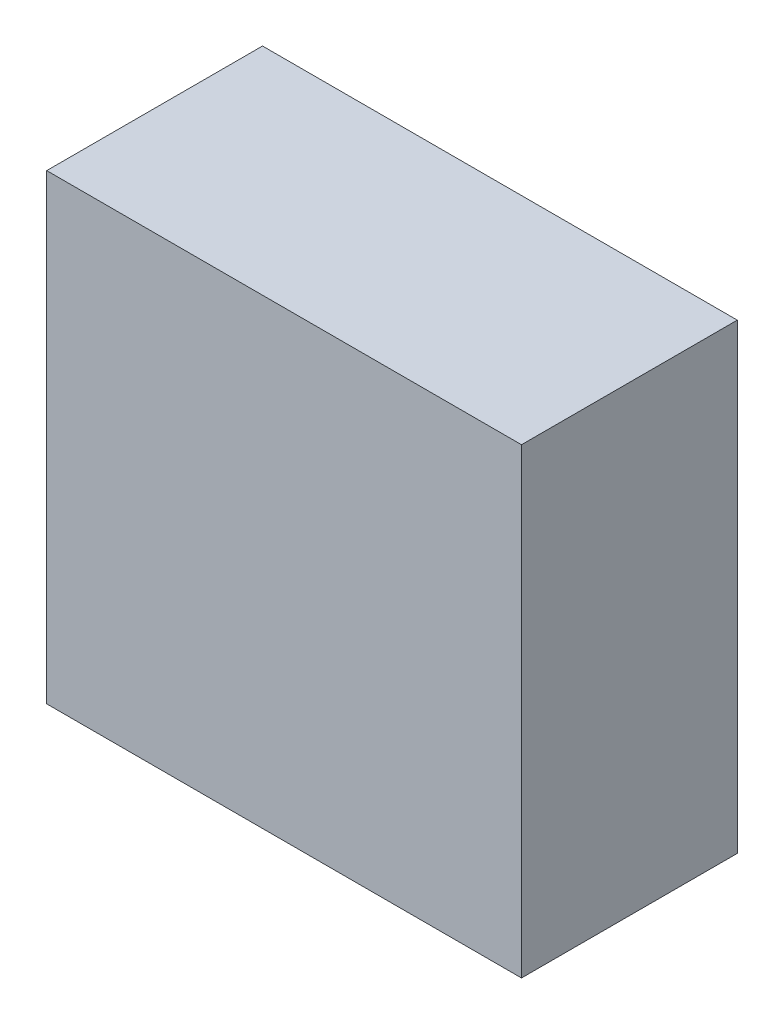
ISO-10303-21;
HEADER;
FILE_DESCRIPTION(('STEP AP214'),'2;1');
FILE_NAME('part.step','',(''),(''),'','','');
FILE_SCHEMA(('AUTOMOTIVE_DESIGN { 1 0 10303 214 1 1 1 1 }'));
ENDSEC;
DATA;
#1=APPLICATION_CONTEXT('core data for automotive mechanical design processes');
#2=APPLICATION_PROTOCOL_DEFINITION('international standard','automotive_design',2000,#1);
#3=PRODUCT_CONTEXT('',#1,'mechanical');
#4=PRODUCT('Part','Part','',(#3));
#5=PRODUCT_RELATED_PRODUCT_CATEGORY('part','',(#4));
#6=PRODUCT_DEFINITION_FORMATION('','',#4);
#7=PRODUCT_DEFINITION_CONTEXT('part definition',#1,'design');
#8=PRODUCT_DEFINITION('design','',#6,#7);
#9=PRODUCT_DEFINITION_SHAPE('','',#8);
#10=(LENGTH_UNIT() NAMED_UNIT(*) SI_UNIT(.MILLI.,.METRE.));
#11=(NAMED_UNIT(*) PLANE_ANGLE_UNIT() SI_UNIT($,.RADIAN.));
#12=(NAMED_UNIT(*) SI_UNIT($,.STERADIAN.) SOLID_ANGLE_UNIT());
#13=UNCERTAINTY_MEASURE_WITH_UNIT(LENGTH_MEASURE(1.E-05),#10,'distance_accuracy_value','');
#14=(GEOMETRIC_REPRESENTATION_CONTEXT(3) GLOBAL_UNCERTAINTY_ASSIGNED_CONTEXT((#13)) GLOBAL_UNIT_ASSIGNED_CONTEXT((#10,
#11,#12)) REPRESENTATION_CONTEXT('',''));
#15=CARTESIAN_POINT('',(0.,0.,0.));
#16=DIRECTION('',(0.,0.,1.));
#17=DIRECTION('',(1.,0.,0.));
#18=AXIS2_PLACEMENT_3D('',#15,#16,#17);
#19=CARTESIAN_POINT('',(0.,27.178,0.));
#20=DIRECTION('',(1.,0.,0.));
#21=DIRECTION('',(0.,0.,-1.));
#22=AXIS2_PLACEMENT_3D('',#19,#20,#21);
#23=PLANE('',#22);
#24=DIRECTION('',(0.,0.,1.));
#25=VECTOR('',#24,1.);
#26=CARTESIAN_POINT('',(0.,0.,0.));
#27=LINE('',#26,#25);
#28=CARTESIAN_POINT('',(0.,0.,-12.7));
#29=VERTEX_POINT('',#28);
#30=CARTESIAN_POINT('',(0.,0.,0.));
#31=VERTEX_POINT('',#30);
#32=EDGE_CURVE('E107',#29,#31,#27,.T.);
#33=ORIENTED_EDGE('',*,*,#32,.T.);
#34=DIRECTION('',(0.,-1.,0.));
#35=VECTOR('',#34,1.);
#36=CARTESIAN_POINT('',(0.,27.178,0.));
#37=LINE('',#36,#35);
#38=CARTESIAN_POINT('',(0.,27.178,0.));
#39=VERTEX_POINT('',#38);
#40=EDGE_CURVE('E11',#39,#31,#37,.T.);
#41=ORIENTED_EDGE('',*,*,#40,.F.);
#42=DIRECTION('',(0.,0.,1.));
#43=VECTOR('',#42,1.);
#44=CARTESIAN_POINT('',(0.,27.178,0.));
#45=LINE('',#44,#43);
#46=CARTESIAN_POINT('',(0.,27.178,-12.7));
#47=VERTEX_POINT('',#46);
#48=EDGE_CURVE('E91',#47,#39,#45,.T.);
#49=ORIENTED_EDGE('',*,*,#48,.F.);
#50=DIRECTION('',(0.,-1.,0.));
#51=VECTOR('',#50,1.);
#52=CARTESIAN_POINT('',(0.,27.178,-12.7));
#53=LINE('',#52,#51);
#54=EDGE_CURVE('E103',#47,#29,#53,.T.);
#55=ORIENTED_EDGE('',*,*,#54,.T.);
#56=EDGE_LOOP('',(#33,#41,#49,#55));
#57=FACE_BOUND('',#56,.T.);
#58=ADVANCED_FACE('F39',(#57),#23,.F.);
#59=CARTESIAN_POINT('',(0.,27.178,0.));
#60=DIRECTION('',(0.,0.,-1.));
#61=DIRECTION('',(-1.,0.,0.));
#62=AXIS2_PLACEMENT_3D('',#59,#60,#61);
#63=PLANE('',#62);
#64=DIRECTION('',(1.,0.,0.));
#65=VECTOR('',#64,1.);
#66=CARTESIAN_POINT('',(0.,0.,0.));
#67=LINE('',#66,#65);
#68=CARTESIAN_POINT('',(27.94,0.,0.));
#69=VERTEX_POINT('',#68);
#70=EDGE_CURVE('E96',#31,#69,#67,.T.);
#71=ORIENTED_EDGE('',*,*,#70,.T.);
#72=DIRECTION('',(0.,-1.,0.));
#73=VECTOR('',#72,1.);
#74=CARTESIAN_POINT('',(27.94,27.178,0.));
#75=LINE('',#74,#73);
#76=CARTESIAN_POINT('',(27.94,27.178,0.));
#77=VERTEX_POINT('',#76);
#78=EDGE_CURVE('E48',#77,#69,#75,.T.);
#79=ORIENTED_EDGE('',*,*,#78,.F.);
#80=DIRECTION('',(1.,0.,0.));
#81=VECTOR('',#80,1.);
#82=CARTESIAN_POINT('',(0.,27.178,0.));
#83=LINE('',#82,#81);
#84=EDGE_CURVE('E86',#39,#77,#83,.T.);
#85=ORIENTED_EDGE('',*,*,#84,.F.);
#86=ORIENTED_EDGE('',*,*,#40,.T.);
#87=EDGE_LOOP('',(#71,#79,#85,#86));
#88=FACE_BOUND('',#87,.T.);
#89=ADVANCED_FACE('F95',(#88),#63,.F.);
#90=CARTESIAN_POINT('',(27.94,27.178,0.));
#91=DIRECTION('',(-1.,0.,0.));
#92=DIRECTION('',(0.,0.,1.));
#93=AXIS2_PLACEMENT_3D('',#90,#91,#92);
#94=PLANE('',#93);
#95=DIRECTION('',(0.,0.,-1.));
#96=VECTOR('',#95,1.);
#97=CARTESIAN_POINT('',(27.94,0.,0.));
#98=LINE('',#97,#96);
#99=CARTESIAN_POINT('',(27.94,0.,-12.7));
#100=VERTEX_POINT('',#99);
#101=EDGE_CURVE('E73',#69,#100,#98,.T.);
#102=ORIENTED_EDGE('',*,*,#101,.T.);
#103=DIRECTION('',(0.,-1.,0.));
#104=VECTOR('',#103,1.);
#105=CARTESIAN_POINT('',(27.94,27.178,-12.7));
#106=LINE('',#105,#104);
#107=CARTESIAN_POINT('',(27.94,27.178,-12.7));
#108=VERTEX_POINT('',#107);
#109=EDGE_CURVE('E98',#108,#100,#106,.T.);
#110=ORIENTED_EDGE('',*,*,#109,.F.);
#111=DIRECTION('',(0.,0.,-1.));
#112=VECTOR('',#111,1.);
#113=CARTESIAN_POINT('',(27.94,27.178,0.));
#114=LINE('',#113,#112);
#115=EDGE_CURVE('E89',#77,#108,#114,.T.);
#116=ORIENTED_EDGE('',*,*,#115,.F.);
#117=ORIENTED_EDGE('',*,*,#78,.T.);
#118=EDGE_LOOP('',(#102,#110,#116,#117));
#119=FACE_BOUND('',#118,.T.);
#120=ADVANCED_FACE('F99',(#119),#94,.F.);
#121=CARTESIAN_POINT('',(0.,27.178,-12.7));
#122=DIRECTION('',(0.,0.,1.));
#123=DIRECTION('',(1.,0.,0.));
#124=AXIS2_PLACEMENT_3D('',#121,#122,#123);
#125=PLANE('',#124);
#126=DIRECTION('',(-1.,0.,0.));
#127=VECTOR('',#126,1.);
#128=CARTESIAN_POINT('',(0.,0.,-12.7));
#129=LINE('',#128,#127);
#130=EDGE_CURVE('E79',#100,#29,#129,.T.);
#131=ORIENTED_EDGE('',*,*,#130,.T.);
#132=ORIENTED_EDGE('',*,*,#54,.F.);
#133=DIRECTION('',(-1.,0.,0.));
#134=VECTOR('',#133,1.);
#135=CARTESIAN_POINT('',(0.,27.178,-12.7));
#136=LINE('',#135,#134);
#137=EDGE_CURVE('E56',#108,#47,#136,.T.);
#138=ORIENTED_EDGE('',*,*,#137,.F.);
#139=ORIENTED_EDGE('',*,*,#109,.T.);
#140=EDGE_LOOP('',(#131,#132,#138,#139));
#141=FACE_BOUND('',#140,.T.);
#142=ADVANCED_FACE('F120',(#141),#125,.F.);
#143=CARTESIAN_POINT('',(0.,27.178,0.));
#144=DIRECTION('',(0.,-1.,0.));
#145=DIRECTION('',(0.,0.,-1.));
#146=AXIS2_PLACEMENT_3D('',#143,#144,#145);
#147=PLANE('',#146);
#148=ORIENTED_EDGE('',*,*,#48,.T.);
#149=ORIENTED_EDGE('',*,*,#84,.T.);
#150=ORIENTED_EDGE('',*,*,#115,.T.);
#151=ORIENTED_EDGE('',*,*,#137,.T.);
#152=EDGE_LOOP('',(#148,#149,#150,#151));
#153=FACE_BOUND('',#152,.T.);
#154=ADVANCED_FACE('F87',(#153),#147,.F.);
#155=CARTESIAN_POINT('',(0.,0.,0.));
#156=DIRECTION('',(0.,-1.,0.));
#157=DIRECTION('',(0.,0.,-1.));
#158=AXIS2_PLACEMENT_3D('',#155,#156,#157);
#159=PLANE('',#158);
#160=ORIENTED_EDGE('',*,*,#32,.F.);
#161=ORIENTED_EDGE('',*,*,#130,.F.);
#162=ORIENTED_EDGE('',*,*,#101,.F.);
#163=ORIENTED_EDGE('',*,*,#70,.F.);
#164=EDGE_LOOP('',(#160,#161,#162,#163));
#165=FACE_BOUND('',#164,.T.);
#166=ADVANCED_FACE('F123',(#165),#159,.T.);
#167=CLOSED_SHELL('',(#58,#89,#120,#142,#154,#166));
#168=MANIFOLD_SOLID_BREP('B2',#167);
#169=ADVANCED_BREP_SHAPE_REPRESENTATION('',(#18,#168),#14);
#170=SHAPE_DEFINITION_REPRESENTATION(#9,#169);
ENDSEC;
END-ISO-10303-21;
